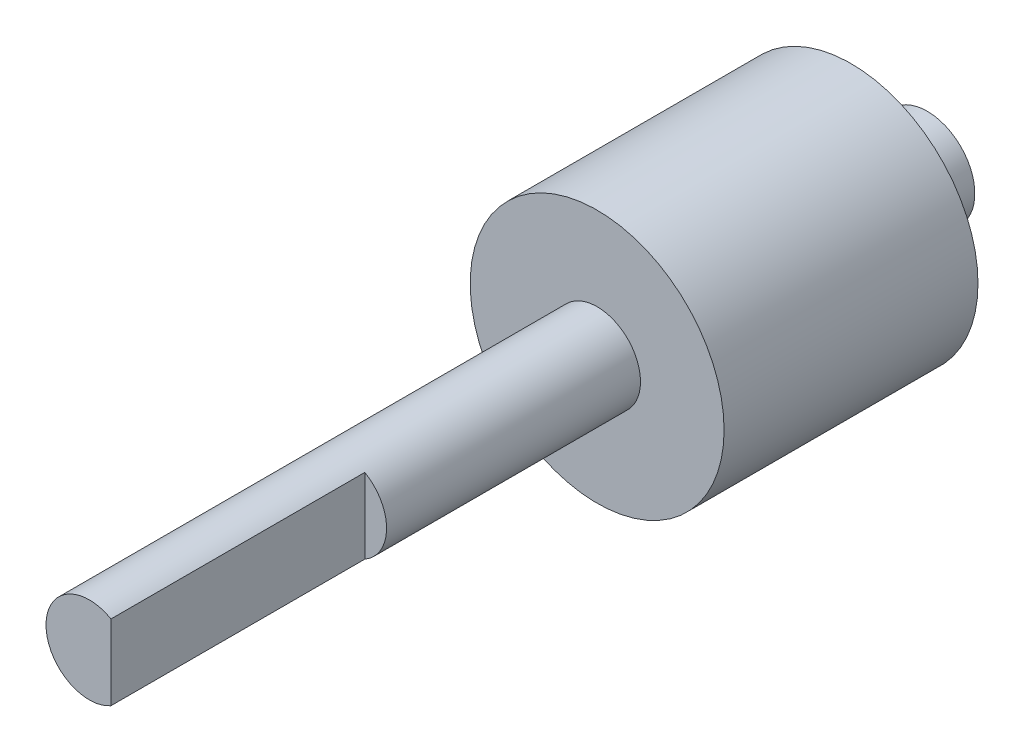
ISO-10303-21;
HEADER;
FILE_DESCRIPTION(('STEP AP214'),'2;1');
FILE_NAME('part.step','',(''),(''),'','','');
FILE_SCHEMA(('AUTOMOTIVE_DESIGN { 1 0 10303 214 1 1 1 1 }'));
ENDSEC;
DATA;
#1=APPLICATION_CONTEXT('core data for automotive mechanical design processes');
#2=APPLICATION_PROTOCOL_DEFINITION('international standard','automotive_design',2000,#1);
#3=PRODUCT_CONTEXT('',#1,'mechanical');
#4=PRODUCT('Part','Part','',(#3));
#5=PRODUCT_RELATED_PRODUCT_CATEGORY('part','',(#4));
#6=PRODUCT_DEFINITION_FORMATION('','',#4);
#7=PRODUCT_DEFINITION_CONTEXT('part definition',#1,'design');
#8=PRODUCT_DEFINITION('design','',#6,#7);
#9=PRODUCT_DEFINITION_SHAPE('','',#8);
#10=(LENGTH_UNIT() NAMED_UNIT(*) SI_UNIT(.MILLI.,.METRE.));
#11=(NAMED_UNIT(*) PLANE_ANGLE_UNIT() SI_UNIT($,.RADIAN.));
#12=(NAMED_UNIT(*) SI_UNIT($,.STERADIAN.) SOLID_ANGLE_UNIT());
#13=UNCERTAINTY_MEASURE_WITH_UNIT(LENGTH_MEASURE(1.E-05),#10,'distance_accuracy_value','');
#14=(GEOMETRIC_REPRESENTATION_CONTEXT(3) GLOBAL_UNCERTAINTY_ASSIGNED_CONTEXT((#13)) GLOBAL_UNIT_ASSIGNED_CONTEXT((#10,
#11,#12)) REPRESENTATION_CONTEXT('',''));
#15=CARTESIAN_POINT('',(0.,0.,0.));
#16=DIRECTION('',(0.,0.,1.));
#17=DIRECTION('',(1.,0.,0.));
#18=AXIS2_PLACEMENT_3D('',#15,#16,#17);
#19=CARTESIAN_POINT('',(-12.4444444444445,13.9222222222223,10.));
#20=DIRECTION('',(0.,0.,-1.));
#21=DIRECTION('',(-1.,0.,0.));
#22=AXIS2_PLACEMENT_3D('',#19,#20,#21);
#23=CYLINDRICAL_SURFACE('',#22,5.);
#24=CARTESIAN_POINT('',(-12.4444444444445,13.9222222222223,10.));
#25=DIRECTION('',(0.,0.,1.));
#26=DIRECTION('',(1.,0.,0.));
#27=AXIS2_PLACEMENT_3D('',#24,#25,#26);
#28=CIRCLE('',#27,5.);
#29=CARTESIAN_POINT('',(-7.44444444444447,13.9222222222223,10.));
#30=VERTEX_POINT('',#29);
#31=EDGE_CURVE('E101',#30,#30,#28,.T.);
#32=ORIENTED_EDGE('',*,*,#31,.F.);
#33=EDGE_LOOP('',(#32));
#34=FACE_BOUND('',#33,.T.);
#35=CARTESIAN_POINT('',(-12.4444444444445,13.9222222222223,0.));
#36=DIRECTION('',(0.,0.,1.));
#37=DIRECTION('',(1.,0.,0.));
#38=AXIS2_PLACEMENT_3D('',#35,#36,#37);
#39=CIRCLE('',#38,5.);
#40=CARTESIAN_POINT('',(-7.44444444444447,13.9222222222223,0.));
#41=VERTEX_POINT('',#40);
#42=EDGE_CURVE('E48',#41,#41,#39,.T.);
#43=ORIENTED_EDGE('',*,*,#42,.T.);
#44=EDGE_LOOP('',(#43));
#45=FACE_BOUND('',#44,.T.);
#46=ADVANCED_FACE('F45',(#34,#45),#23,.T.);
#47=CARTESIAN_POINT('',(-12.4444444444445,13.9222222222223,10.));
#48=DIRECTION('',(0.,0.,1.));
#49=DIRECTION('',(1.,0.,0.));
#50=AXIS2_PLACEMENT_3D('',#47,#48,#49);
#51=PLANE('',#50);
#52=CARTESIAN_POINT('',(-12.4444444444445,13.9222222222223,10.));
#53=DIRECTION('',(0.,0.,1.));
#54=DIRECTION('',(1.,0.,0.));
#55=AXIS2_PLACEMENT_3D('',#52,#53,#54);
#56=CIRCLE('',#55,1.707);
#57=CARTESIAN_POINT('',(-10.7374444444445,13.9222222222223,10.));
#58=VERTEX_POINT('',#57);
#59=EDGE_CURVE('E54',#58,#58,#56,.T.);
#60=ORIENTED_EDGE('',*,*,#59,.F.);
#61=EDGE_LOOP('',(#60));
#62=FACE_BOUND('',#61,.T.);
#63=ORIENTED_EDGE('',*,*,#31,.T.);
#64=EDGE_LOOP('',(#63));
#65=FACE_BOUND('',#64,.T.);
#66=ADVANCED_FACE('F113',(#62,#65),#51,.T.);
#67=CARTESIAN_POINT('',(-12.4444444444445,13.9222222222223,0.));
#68=DIRECTION('',(0.,0.,1.));
#69=DIRECTION('',(1.,0.,0.));
#70=AXIS2_PLACEMENT_3D('',#67,#68,#69);
#71=PLANE('',#70);
#72=CARTESIAN_POINT('',(-12.4444444444445,13.9222222222223,0.));
#73=DIRECTION('',(0.,0.,-1.));
#74=DIRECTION('',(-1.,0.,0.));
#75=AXIS2_PLACEMENT_3D('',#72,#73,#74);
#76=CIRCLE('',#75,1.875);
#77=CARTESIAN_POINT('',(-14.3194444444445,13.9222222222223,0.));
#78=VERTEX_POINT('',#77);
#79=EDGE_CURVE('E11',#78,#78,#76,.T.);
#80=ORIENTED_EDGE('',*,*,#79,.F.);
#81=EDGE_LOOP('',(#80));
#82=FACE_BOUND('',#81,.T.);
#83=ORIENTED_EDGE('',*,*,#42,.F.);
#84=EDGE_LOOP('',(#83));
#85=FACE_BOUND('',#84,.T.);
#86=ADVANCED_FACE('F111',(#82,#85),#71,.F.);
#87=CARTESIAN_POINT('',(-12.4444444444445,13.9222222222223,20.));
#88=DIRECTION('',(0.,0.,-1.));
#89=DIRECTION('',(-1.,0.,0.));
#90=AXIS2_PLACEMENT_3D('',#87,#88,#89);
#91=CYLINDRICAL_SURFACE('',#90,1.707);
#92=CARTESIAN_POINT('',(-12.4444444444445,13.9222222222223,20.));
#93=DIRECTION('',(0.,0.,1.));
#94=DIRECTION('',(1.,0.,0.));
#95=AXIS2_PLACEMENT_3D('',#92,#93,#94);
#96=CIRCLE('',#95,1.707);
#97=CARTESIAN_POINT('',(-11.5938863923399,12.4422222222223,20.));
#98=VERTEX_POINT('',#97);
#99=CARTESIAN_POINT('',(-11.5938863923399,15.4022222222223,20.));
#100=VERTEX_POINT('',#99);
#101=EDGE_CURVE('E73',#98,#100,#96,.T.);
#102=ORIENTED_EDGE('',*,*,#101,.F.);
#103=DIRECTION('',(0.,0.,-1.));
#104=VECTOR('',#103,1.);
#105=CARTESIAN_POINT('',(-11.5938863923399,12.4422222222223,30.));
#106=LINE('',#105,#104);
#107=CARTESIAN_POINT('',(-11.5938863923399,12.4422222222223,30.));
#108=VERTEX_POINT('',#107);
#109=EDGE_CURVE('E80',#108,#98,#106,.T.);
#110=ORIENTED_EDGE('',*,*,#109,.F.);
#111=CARTESIAN_POINT('',(-12.4444444444445,13.9222222222223,30.));
#112=DIRECTION('',(0.,0.,1.));
#113=DIRECTION('',(1.,0.,0.));
#114=AXIS2_PLACEMENT_3D('',#111,#112,#113);
#115=CIRCLE('',#114,1.707);
#116=CARTESIAN_POINT('',(-11.5938863923399,15.4022222222223,30.));
#117=VERTEX_POINT('',#116);
#118=EDGE_CURVE('E87',#117,#108,#115,.T.);
#119=ORIENTED_EDGE('',*,*,#118,.F.);
#120=DIRECTION('',(0.,0.,-1.));
#121=VECTOR('',#120,1.);
#122=CARTESIAN_POINT('',(-11.5938863923399,15.4022222222223,30.));
#123=LINE('',#122,#121);
#124=EDGE_CURVE('E84',#117,#100,#123,.T.);
#125=ORIENTED_EDGE('',*,*,#124,.T.);
#126=EDGE_LOOP('',(#102,#110,#119,#125));
#127=FACE_BOUND('',#126,.T.);
#128=ORIENTED_EDGE('',*,*,#59,.T.);
#129=EDGE_LOOP('',(#128));
#130=FACE_BOUND('',#129,.T.);
#131=ADVANCED_FACE('F90',(#127,#130),#91,.T.);
#132=CARTESIAN_POINT('',(-12.4444444444445,13.9222222222223,20.));
#133=DIRECTION('',(0.,0.,1.));
#134=DIRECTION('',(1.,0.,0.));
#135=AXIS2_PLACEMENT_3D('',#132,#133,#134);
#136=PLANE('',#135);
#137=DIRECTION('',(0.,1.,0.));
#138=VECTOR('',#137,1.);
#139=CARTESIAN_POINT('',(-11.5938863923399,15.4022222222223,20.));
#140=LINE('',#139,#138);
#141=EDGE_CURVE('E61',#98,#100,#140,.T.);
#142=ORIENTED_EDGE('',*,*,#141,.F.);
#143=ORIENTED_EDGE('',*,*,#101,.T.);
#144=EDGE_LOOP('',(#142,#143));
#145=FACE_BOUND('',#144,.T.);
#146=ADVANCED_FACE('F74',(#145),#136,.T.);
#147=CARTESIAN_POINT('',(-11.5938863923399,15.4022222222223,30.));
#148=DIRECTION('',(-1.,0.,0.));
#149=DIRECTION('',(0.,0.,1.));
#150=AXIS2_PLACEMENT_3D('',#147,#148,#149);
#151=PLANE('',#150);
#152=ORIENTED_EDGE('',*,*,#141,.T.);
#153=ORIENTED_EDGE('',*,*,#124,.F.);
#154=DIRECTION('',(0.,1.,0.));
#155=VECTOR('',#154,1.);
#156=CARTESIAN_POINT('',(-11.5938863923399,15.4022222222223,30.));
#157=LINE('',#156,#155);
#158=EDGE_CURVE('E69',#108,#117,#157,.T.);
#159=ORIENTED_EDGE('',*,*,#158,.F.);
#160=ORIENTED_EDGE('',*,*,#109,.T.);
#161=EDGE_LOOP('',(#152,#153,#159,#160));
#162=FACE_BOUND('',#161,.T.);
#163=ADVANCED_FACE('F83',(#162),#151,.F.);
#164=CARTESIAN_POINT('',(-12.4444444444445,13.9222222222223,30.));
#165=DIRECTION('',(0.,0.,1.));
#166=DIRECTION('',(1.,0.,0.));
#167=AXIS2_PLACEMENT_3D('',#164,#165,#166);
#168=PLANE('',#167);
#169=ORIENTED_EDGE('',*,*,#118,.T.);
#170=ORIENTED_EDGE('',*,*,#158,.T.);
#171=EDGE_LOOP('',(#169,#170));
#172=FACE_BOUND('',#171,.T.);
#173=ADVANCED_FACE('F153',(#172),#168,.T.);
#174=CARTESIAN_POINT('',(-12.4444444444445,13.9222222222223,-3.));
#175=DIRECTION('',(0.,0.,1.));
#176=DIRECTION('',(1.,0.,0.));
#177=AXIS2_PLACEMENT_3D('',#174,#175,#176);
#178=CYLINDRICAL_SURFACE('',#177,1.875);
#179=CARTESIAN_POINT('',(-12.4444444444445,13.9222222222223,-3.));
#180=DIRECTION('',(0.,0.,-1.));
#181=DIRECTION('',(-1.,0.,0.));
#182=AXIS2_PLACEMENT_3D('',#179,#180,#181);
#183=CIRCLE('',#182,1.875);
#184=CARTESIAN_POINT('',(-14.3194444444445,13.9222222222223,-3.));
#185=VERTEX_POINT('',#184);
#186=EDGE_CURVE('E88',#185,#185,#183,.T.);
#187=ORIENTED_EDGE('',*,*,#186,.F.);
#188=EDGE_LOOP('',(#187));
#189=FACE_BOUND('',#188,.T.);
#190=ORIENTED_EDGE('',*,*,#79,.T.);
#191=EDGE_LOOP('',(#190));
#192=FACE_BOUND('',#191,.T.);
#193=ADVANCED_FACE('F160',(#189,#192),#178,.T.);
#194=CARTESIAN_POINT('',(-12.4444444444445,13.9222222222223,-3.));
#195=DIRECTION('',(0.,0.,-1.));
#196=DIRECTION('',(-1.,0.,0.));
#197=AXIS2_PLACEMENT_3D('',#194,#195,#196);
#198=PLANE('',#197);
#199=ORIENTED_EDGE('',*,*,#186,.T.);
#200=EDGE_LOOP('',(#199));
#201=FACE_BOUND('',#200,.T.);
#202=ADVANCED_FACE('F166',(#201),#198,.T.);
#203=CLOSED_SHELL('',(#46,#66,#86,#131,#146,#163,#173,#193,#202));
#204=MANIFOLD_SOLID_BREP('B2',#203);
#205=ADVANCED_BREP_SHAPE_REPRESENTATION('',(#18,#204),#14);
#206=SHAPE_DEFINITION_REPRESENTATION(#9,#205);
ENDSEC;
END-ISO-10303-21;
